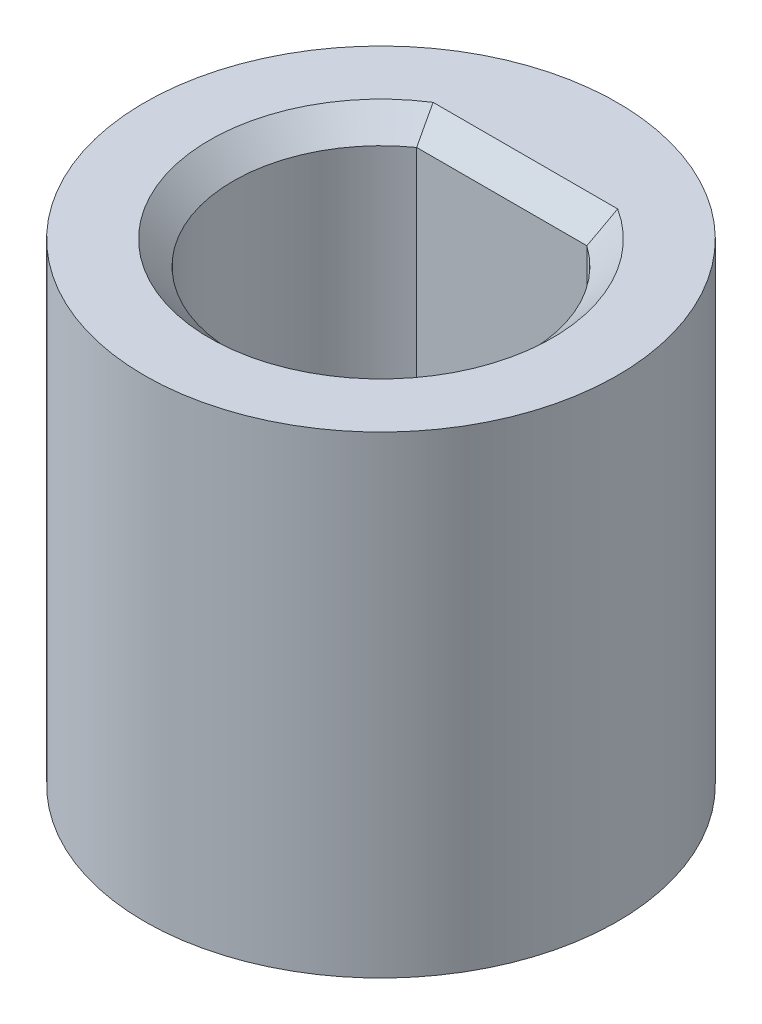
ISO-10303-21;
HEADER;
FILE_DESCRIPTION(('STEP AP214'),'2;1');
FILE_NAME('part.step','',(''),(''),'','','');
FILE_SCHEMA(('AUTOMOTIVE_DESIGN { 1 0 10303 214 1 1 1 1 }'));
ENDSEC;
DATA;
#1=APPLICATION_CONTEXT('core data for automotive mechanical design processes');
#2=APPLICATION_PROTOCOL_DEFINITION('international standard','automotive_design',2000,#1);
#3=PRODUCT_CONTEXT('',#1,'mechanical');
#4=PRODUCT('Part','Part','',(#3));
#5=PRODUCT_RELATED_PRODUCT_CATEGORY('part','',(#4));
#6=PRODUCT_DEFINITION_FORMATION('','',#4);
#7=PRODUCT_DEFINITION_CONTEXT('part definition',#1,'design');
#8=PRODUCT_DEFINITION('design','',#6,#7);
#9=PRODUCT_DEFINITION_SHAPE('','',#8);
#10=(LENGTH_UNIT() NAMED_UNIT(*) SI_UNIT(.MILLI.,.METRE.));
#11=(NAMED_UNIT(*) PLANE_ANGLE_UNIT() SI_UNIT($,.RADIAN.));
#12=(NAMED_UNIT(*) SI_UNIT($,.STERADIAN.) SOLID_ANGLE_UNIT());
#13=UNCERTAINTY_MEASURE_WITH_UNIT(LENGTH_MEASURE(1.E-05),#10,'distance_accuracy_value','');
#14=(GEOMETRIC_REPRESENTATION_CONTEXT(3) GLOBAL_UNCERTAINTY_ASSIGNED_CONTEXT((#13)) GLOBAL_UNIT_ASSIGNED_CONTEXT((#10,
#11,#12)) REPRESENTATION_CONTEXT('',''));
#15=CARTESIAN_POINT('',(0.,0.,0.));
#16=DIRECTION('',(0.,0.,1.));
#17=DIRECTION('',(1.,0.,0.));
#18=AXIS2_PLACEMENT_3D('',#15,#16,#17);
#19=CARTESIAN_POINT('',(0.,10.,0.));
#20=DIRECTION('',(0.,-1.,0.));
#21=DIRECTION('',(0.,0.,-1.));
#22=AXIS2_PLACEMENT_3D('',#19,#20,#21);
#23=CYLINDRICAL_SURFACE('',#22,5.);
#24=CARTESIAN_POINT('',(0.,10.,0.));
#25=DIRECTION('',(0.,1.,0.));
#26=DIRECTION('',(0.,0.,1.));
#27=AXIS2_PLACEMENT_3D('',#24,#25,#26);
#28=CIRCLE('',#27,5.);
#29=CARTESIAN_POINT('',(0.,10.,5.));
#30=VERTEX_POINT('',#29);
#31=EDGE_CURVE('E101',#30,#30,#28,.T.);
#32=ORIENTED_EDGE('',*,*,#31,.F.);
#33=EDGE_LOOP('',(#32));
#34=FACE_BOUND('',#33,.T.);
#35=CARTESIAN_POINT('',(0.,0.,0.));
#36=DIRECTION('',(0.,1.,0.));
#37=DIRECTION('',(0.,0.,1.));
#38=AXIS2_PLACEMENT_3D('',#35,#36,#37);
#39=CIRCLE('',#38,5.);
#40=CARTESIAN_POINT('',(0.,0.,5.));
#41=VERTEX_POINT('',#40);
#42=EDGE_CURVE('E99',#41,#41,#39,.T.);
#43=ORIENTED_EDGE('',*,*,#42,.T.);
#44=EDGE_LOOP('',(#43));
#45=FACE_BOUND('',#44,.T.);
#46=ADVANCED_FACE('F38',(#34,#45),#23,.T.);
#47=CARTESIAN_POINT('',(0.,10.,0.));
#48=DIRECTION('',(0.,1.,0.));
#49=DIRECTION('',(0.,0.,1.));
#50=AXIS2_PLACEMENT_3D('',#47,#48,#49);
#51=PLANE('',#50);
#52=DIRECTION('',(1.,0.,0.));
#53=VECTOR('',#52,1.);
#54=CARTESIAN_POINT('',(1.7993332098308,10.,-3.055));
#55=LINE('',#54,#53);
#56=CARTESIAN_POINT('',(-1.95130725412478,10.,-3.055));
#57=VERTEX_POINT('',#56);
#58=CARTESIAN_POINT('',(1.95130725412478,10.,-3.055));
#59=VERTEX_POINT('',#58);
#60=EDGE_CURVE('E60',#57,#59,#55,.T.);
#61=ORIENTED_EDGE('',*,*,#60,.T.);
#62=CARTESIAN_POINT('',(0.,10.,0.));
#63=DIRECTION('',(0.,1.,0.));
#64=DIRECTION('',(0.,0.,1.));
#65=AXIS2_PLACEMENT_3D('',#62,#63,#64);
#66=CIRCLE('',#65,3.625);
#67=EDGE_CURVE('E53',#59,#57,#66,.F.);
#68=ORIENTED_EDGE('',*,*,#67,.T.);
#69=EDGE_LOOP('',(#61,#68));
#70=FACE_BOUND('',#69,.T.);
#71=ORIENTED_EDGE('',*,*,#31,.T.);
#72=EDGE_LOOP('',(#71));
#73=FACE_BOUND('',#72,.T.);
#74=ADVANCED_FACE('F123',(#70,#73),#51,.T.);
#75=CARTESIAN_POINT('',(0.,0.,0.));
#76=DIRECTION('',(0.,1.,0.));
#77=DIRECTION('',(0.,0.,1.));
#78=AXIS2_PLACEMENT_3D('',#75,#76,#77);
#79=PLANE('',#78);
#80=ORIENTED_EDGE('',*,*,#42,.F.);
#81=EDGE_LOOP('',(#80));
#82=FACE_BOUND('',#81,.T.);
#83=ADVANCED_FACE('F125',(#82),#79,.F.);
#84=CARTESIAN_POINT('',(0.,2.,0.));
#85=DIRECTION('',(0.,1.,0.));
#86=DIRECTION('',(0.,0.,1.));
#87=AXIS2_PLACEMENT_3D('',#84,#85,#86);
#88=CYLINDRICAL_SURFACE('',#87,3.125);
#89=DIRECTION('',(0.,1.,0.));
#90=VECTOR('',#89,1.);
#91=CARTESIAN_POINT('',(-1.7993332098308,2.,-2.555));
#92=LINE('',#91,#90);
#93=CARTESIAN_POINT('',(-1.7993332098308,2.,-2.555));
#94=VERTEX_POINT('',#93);
#95=CARTESIAN_POINT('',(-1.7993332098308,9.5,-2.555));
#96=VERTEX_POINT('',#95);
#97=EDGE_CURVE('E90',#94,#96,#92,.T.);
#98=ORIENTED_EDGE('',*,*,#97,.T.);
#99=CARTESIAN_POINT('',(0.,9.5,0.));
#100=DIRECTION('',(0.,1.,0.));
#101=DIRECTION('',(0.,0.,1.));
#102=AXIS2_PLACEMENT_3D('',#99,#100,#101);
#103=CIRCLE('',#102,3.125);
#104=CARTESIAN_POINT('',(1.7993332098308,9.5,-2.555));
#105=VERTEX_POINT('',#104);
#106=EDGE_CURVE('E87',#96,#105,#103,.T.);
#107=ORIENTED_EDGE('',*,*,#106,.T.);
#108=DIRECTION('',(0.,1.,0.));
#109=VECTOR('',#108,1.);
#110=CARTESIAN_POINT('',(1.7993332098308,2.,-2.555));
#111=LINE('',#110,#109);
#112=CARTESIAN_POINT('',(1.7993332098308,2.,-2.555));
#113=VERTEX_POINT('',#112);
#114=EDGE_CURVE('E81',#113,#105,#111,.T.);
#115=ORIENTED_EDGE('',*,*,#114,.F.);
#116=CARTESIAN_POINT('',(0.,2.,0.));
#117=DIRECTION('',(0.,1.,0.));
#118=DIRECTION('',(0.,0.,1.));
#119=AXIS2_PLACEMENT_3D('',#116,#117,#118);
#120=CIRCLE('',#119,3.125);
#121=EDGE_CURVE('E85',#94,#113,#120,.T.);
#122=ORIENTED_EDGE('',*,*,#121,.F.);
#123=EDGE_LOOP('',(#98,#107,#115,#122));
#124=FACE_BOUND('',#123,.T.);
#125=ADVANCED_FACE('F84',(#124),#88,.F.);
#126=CARTESIAN_POINT('',(-1.7993332098308,2.,-2.555));
#127=DIRECTION('',(0.,0.,-1.));
#128=DIRECTION('',(-1.,0.,0.));
#129=AXIS2_PLACEMENT_3D('',#126,#127,#128);
#130=PLANE('',#129);
#131=ORIENTED_EDGE('',*,*,#114,.T.);
#132=DIRECTION('',(-1.,0.,0.));
#133=VECTOR('',#132,1.);
#134=CARTESIAN_POINT('',(-1.7993332098308,9.5,-2.555));
#135=LINE('',#134,#133);
#136=EDGE_CURVE('E11',#105,#96,#135,.T.);
#137=ORIENTED_EDGE('',*,*,#136,.T.);
#138=ORIENTED_EDGE('',*,*,#97,.F.);
#139=DIRECTION('',(-1.,0.,0.));
#140=VECTOR('',#139,1.);
#141=CARTESIAN_POINT('',(-1.7993332098308,2.,-2.555));
#142=LINE('',#141,#140);
#143=EDGE_CURVE('E91',#113,#94,#142,.T.);
#144=ORIENTED_EDGE('',*,*,#143,.F.);
#145=EDGE_LOOP('',(#131,#137,#138,#144));
#146=FACE_BOUND('',#145,.T.);
#147=ADVANCED_FACE('F96',(#146),#130,.F.);
#148=CARTESIAN_POINT('',(0.,2.,0.));
#149=DIRECTION('',(0.,1.,0.));
#150=DIRECTION('',(0.,0.,1.));
#151=AXIS2_PLACEMENT_3D('',#148,#149,#150);
#152=PLANE('',#151);
#153=ORIENTED_EDGE('',*,*,#121,.T.);
#154=ORIENTED_EDGE('',*,*,#143,.T.);
#155=EDGE_LOOP('',(#153,#154));
#156=FACE_BOUND('',#155,.T.);
#157=ADVANCED_FACE('F94',(#156),#152,.T.);
#158=CARTESIAN_POINT('',(-1.7993332098308,9.5,-2.555));
#159=DIRECTION('',(0.,0.70710678118655,0.707106781186545));
#160=DIRECTION('',(1.,0.,0.));
#161=AXIS2_PLACEMENT_3D('',#158,#159,#160);
#162=PLANE('',#161);
#163=CARTESIAN_POINT('',(1.7993332098308,9.5,-2.555));
#164=CARTESIAN_POINT('',(1.82564288706797,9.58318440883692,-2.63818440883692));
#165=CARTESIAN_POINT('',(1.85146224499835,9.66644333347995,-2.72144333347995));
#166=CARTESIAN_POINT('',(1.90212025724652,9.83311000052906,-2.88811000052906));
#167=CARTESIAN_POINT('',(1.92695891408079,9.9165177425527,-2.9715177425527));
#168=CARTESIAN_POINT('',(1.95130725412478,10.,-3.055));
#169=B_SPLINE_CURVE_WITH_KNOTS('',3,(#163,#164,#165,#166,#167,#168),.UNSPECIFIED.,.F.,.F.,(4,2,
4),(0.,0.361630511412255,0.723260094813062),.UNSPECIFIED.);
#170=EDGE_CURVE('E108',#59,#105,#169,.F.);
#171=ORIENTED_EDGE('',*,*,#170,.F.);
#172=ORIENTED_EDGE('',*,*,#60,.F.);
#173=CARTESIAN_POINT('',(-1.95130725412478,10.,-3.055));
#174=CARTESIAN_POINT('',(-1.92695891408079,9.9165177425527,-2.9715177425527));
#175=CARTESIAN_POINT('',(-1.90212025724651,9.83311000052906,-2.88811000052906));
#176=CARTESIAN_POINT('',(-1.85146224499835,9.66644333347995,-2.72144333347995));
#177=CARTESIAN_POINT('',(-1.82564288706796,9.58318440883692,-2.63818440883692));
#178=CARTESIAN_POINT('',(-1.7993332098308,9.5,-2.555));
#179=B_SPLINE_CURVE_WITH_KNOTS('',3,(#173,#174,#175,#176,#177,#178),.UNSPECIFIED.,.F.,.F.,(4,2,
4),(0.,0.361629583400807,0.723260094813062),.UNSPECIFIED.);
#180=EDGE_CURVE('E44',#96,#57,#179,.F.);
#181=ORIENTED_EDGE('',*,*,#180,.F.);
#182=ORIENTED_EDGE('',*,*,#136,.F.);
#183=EDGE_LOOP('',(#171,#172,#181,#182));
#184=FACE_BOUND('',#183,.T.);
#185=ADVANCED_FACE('F41',(#184),#162,.T.);
#186=CARTESIAN_POINT('',(0.,9.5,0.));
#187=DIRECTION('',(0.,1.,0.));
#188=DIRECTION('',(0.,0.,1.));
#189=AXIS2_PLACEMENT_3D('',#186,#187,#188);
#190=CONICAL_SURFACE('',#189,3.125,0.785398163397452);
#191=ORIENTED_EDGE('',*,*,#180,.T.);
#192=ORIENTED_EDGE('',*,*,#67,.F.);
#193=ORIENTED_EDGE('',*,*,#170,.T.);
#194=ORIENTED_EDGE('',*,*,#106,.F.);
#195=EDGE_LOOP('',(#191,#192,#193,#194));
#196=FACE_BOUND('',#195,.T.);
#197=ADVANCED_FACE('F114',(#196),#190,.F.);
#198=CLOSED_SHELL('',(#46,#74,#83,#125,#147,#157,#185,#197));
#199=MANIFOLD_SOLID_BREP('B2',#198);
#200=ADVANCED_BREP_SHAPE_REPRESENTATION('',(#18,#199),#14);
#201=SHAPE_DEFINITION_REPRESENTATION(#9,#200);
ENDSEC;
END-ISO-10303-21;
